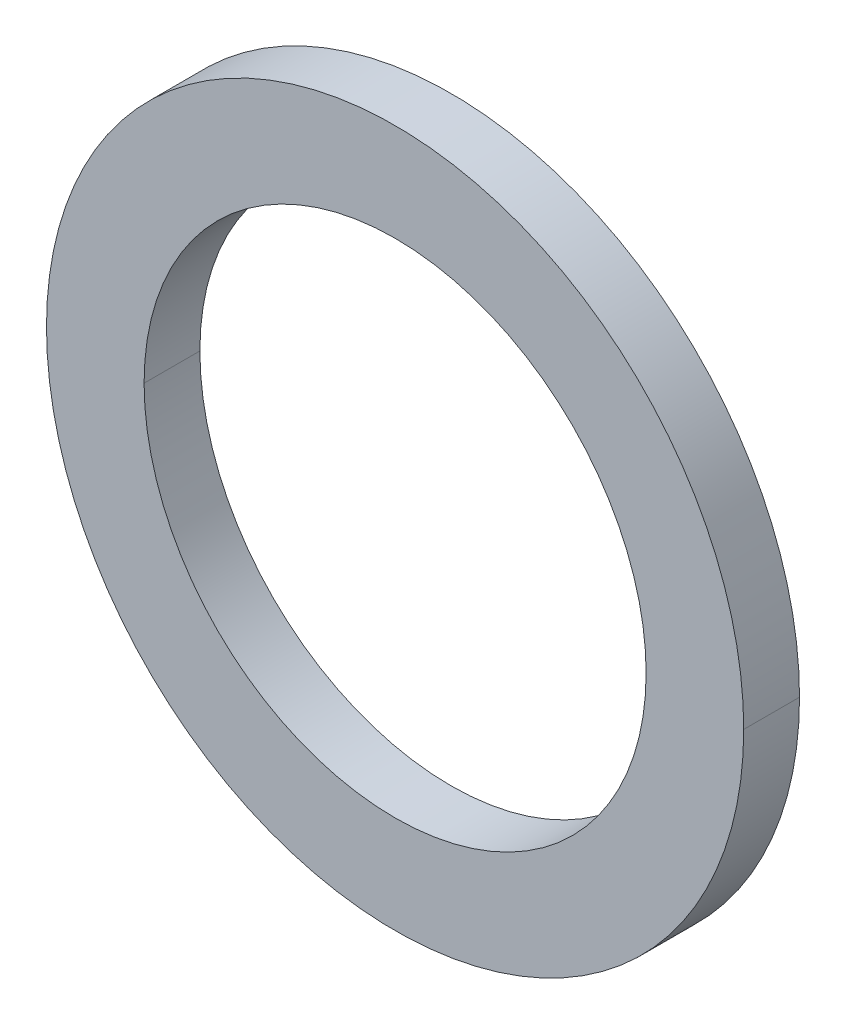
ISO-10303-21;
HEADER;
FILE_DESCRIPTION(('STEP AP214'),'2;1');
FILE_NAME('part.step','',(''),(''),'','','');
FILE_SCHEMA(('AUTOMOTIVE_DESIGN { 1 0 10303 214 1 1 1 1 }'));
ENDSEC;
DATA;
#1=APPLICATION_CONTEXT('core data for automotive mechanical design processes');
#2=APPLICATION_PROTOCOL_DEFINITION('international standard','automotive_design',2000,#1);
#3=PRODUCT_CONTEXT('',#1,'mechanical');
#4=PRODUCT('Part','Part','',(#3));
#5=PRODUCT_RELATED_PRODUCT_CATEGORY('part','',(#4));
#6=PRODUCT_DEFINITION_FORMATION('','',#4);
#7=PRODUCT_DEFINITION_CONTEXT('part definition',#1,'design');
#8=PRODUCT_DEFINITION('design','',#6,#7);
#9=PRODUCT_DEFINITION_SHAPE('','',#8);
#10=(LENGTH_UNIT() NAMED_UNIT(*) SI_UNIT(.MILLI.,.METRE.));
#11=(NAMED_UNIT(*) PLANE_ANGLE_UNIT() SI_UNIT($,.RADIAN.));
#12=(NAMED_UNIT(*) SI_UNIT($,.STERADIAN.) SOLID_ANGLE_UNIT());
#13=UNCERTAINTY_MEASURE_WITH_UNIT(LENGTH_MEASURE(1.E-05),#10,'distance_accuracy_value','');
#14=(GEOMETRIC_REPRESENTATION_CONTEXT(3) GLOBAL_UNCERTAINTY_ASSIGNED_CONTEXT((#13)) GLOBAL_UNIT_ASSIGNED_CONTEXT((#10,
#11,#12)) REPRESENTATION_CONTEXT('',''));
#15=CARTESIAN_POINT('',(0.,0.,0.));
#16=DIRECTION('',(0.,0.,1.));
#17=DIRECTION('',(1.,0.,0.));
#18=AXIS2_PLACEMENT_3D('',#15,#16,#17);
#19=CARTESIAN_POINT('',(0.,0.,1.27));
#20=DIRECTION('',(0.,0.,-1.));
#21=DIRECTION('',(-1.,0.,0.));
#22=AXIS2_PLACEMENT_3D('',#19,#20,#21);
#23=CYLINDRICAL_SURFACE('',#22,5.715);
#24=DIRECTION('',(0.,0.,-1.));
#25=VECTOR('',#24,1.);
#26=CARTESIAN_POINT('',(5.715,0.,1.27));
#27=LINE('',#26,#25);
#28=CARTESIAN_POINT('',(5.715,0.,1.27));
#29=VERTEX_POINT('',#28);
#30=CARTESIAN_POINT('',(5.715,0.,0.));
#31=VERTEX_POINT('',#30);
#32=EDGE_CURVE('E79',#29,#31,#27,.T.);
#33=ORIENTED_EDGE('',*,*,#32,.F.);
#34=CARTESIAN_POINT('',(0.,0.,1.27));
#35=DIRECTION('',(0.,0.,1.));
#36=DIRECTION('',(1.,0.,0.));
#37=AXIS2_PLACEMENT_3D('',#34,#35,#36);
#38=CIRCLE('',#37,5.715);
#39=CARTESIAN_POINT('',(-5.715,0.,1.27));
#40=VERTEX_POINT('',#39);
#41=EDGE_CURVE('E65',#29,#40,#38,.T.);
#42=ORIENTED_EDGE('',*,*,#41,.T.);
#43=DIRECTION('',(0.,0.,-1.));
#44=VECTOR('',#43,1.);
#45=CARTESIAN_POINT('',(-5.715,0.,1.27));
#46=LINE('',#45,#44);
#47=CARTESIAN_POINT('',(-5.715,0.,0.));
#48=VERTEX_POINT('',#47);
#49=EDGE_CURVE('E87',#40,#48,#46,.T.);
#50=ORIENTED_EDGE('',*,*,#49,.T.);
#51=CARTESIAN_POINT('',(0.,0.,0.));
#52=DIRECTION('',(0.,0.,1.));
#53=DIRECTION('',(1.,0.,0.));
#54=AXIS2_PLACEMENT_3D('',#51,#52,#53);
#55=CIRCLE('',#54,5.715);
#56=EDGE_CURVE('E10',#31,#48,#55,.T.);
#57=ORIENTED_EDGE('',*,*,#56,.F.);
#58=EDGE_LOOP('',(#33,#42,#50,#57));
#59=FACE_BOUND('',#58,.T.);
#60=ADVANCED_FACE('F16',(#59),#23,.F.);
#61=CARTESIAN_POINT('',(0.,0.,1.27));
#62=DIRECTION('',(0.,0.,-1.));
#63=DIRECTION('',(-1.,0.,0.));
#64=AXIS2_PLACEMENT_3D('',#61,#62,#63);
#65=CYLINDRICAL_SURFACE('',#64,7.9375);
#66=DIRECTION('',(0.,0.,-1.));
#67=VECTOR('',#66,1.);
#68=CARTESIAN_POINT('',(7.9375,0.,1.27));
#69=LINE('',#68,#67);
#70=CARTESIAN_POINT('',(7.9375,0.,1.27));
#71=VERTEX_POINT('',#70);
#72=CARTESIAN_POINT('',(7.9375,0.,0.));
#73=VERTEX_POINT('',#72);
#74=EDGE_CURVE('E99',#71,#73,#69,.T.);
#75=ORIENTED_EDGE('',*,*,#74,.F.);
#76=CARTESIAN_POINT('',(0.,0.,1.27));
#77=DIRECTION('',(0.,0.,1.));
#78=DIRECTION('',(1.,0.,0.));
#79=AXIS2_PLACEMENT_3D('',#76,#77,#78);
#80=CIRCLE('',#79,7.9375);
#81=CARTESIAN_POINT('',(-7.9375,0.,1.27));
#82=VERTEX_POINT('',#81);
#83=EDGE_CURVE('E76',#82,#71,#80,.T.);
#84=ORIENTED_EDGE('',*,*,#83,.F.);
#85=DIRECTION('',(0.,0.,-1.));
#86=VECTOR('',#85,1.);
#87=CARTESIAN_POINT('',(-7.9375,0.,1.27));
#88=LINE('',#87,#86);
#89=CARTESIAN_POINT('',(-7.9375,0.,0.));
#90=VERTEX_POINT('',#89);
#91=EDGE_CURVE('E221',#82,#90,#88,.T.);
#92=ORIENTED_EDGE('',*,*,#91,.T.);
#93=CARTESIAN_POINT('',(0.,0.,0.));
#94=DIRECTION('',(0.,0.,1.));
#95=DIRECTION('',(1.,0.,0.));
#96=AXIS2_PLACEMENT_3D('',#93,#94,#95);
#97=CIRCLE('',#96,7.9375);
#98=EDGE_CURVE('E27',#90,#73,#97,.T.);
#99=ORIENTED_EDGE('',*,*,#98,.T.);
#100=EDGE_LOOP('',(#75,#84,#92,#99));
#101=FACE_BOUND('',#100,.T.);
#102=ADVANCED_FACE('F18',(#101),#65,.T.);
#103=CARTESIAN_POINT('',(0.,0.,0.));
#104=DIRECTION('',(0.,0.,1.));
#105=DIRECTION('',(1.,0.,0.));
#106=AXIS2_PLACEMENT_3D('',#103,#104,#105);
#107=PLANE('',#106);
#108=CARTESIAN_POINT('',(0.,0.,0.));
#109=DIRECTION('',(0.,0.,1.));
#110=DIRECTION('',(1.,0.,0.));
#111=AXIS2_PLACEMENT_3D('',#108,#109,#110);
#112=CIRCLE('',#111,5.715);
#113=EDGE_CURVE('E84',#48,#31,#112,.T.);
#114=ORIENTED_EDGE('',*,*,#113,.T.);
#115=ORIENTED_EDGE('',*,*,#56,.T.);
#116=EDGE_LOOP('',(#114,#115));
#117=FACE_BOUND('',#116,.T.);
#118=ORIENTED_EDGE('',*,*,#98,.F.);
#119=CARTESIAN_POINT('',(0.,0.,0.));
#120=DIRECTION('',(0.,0.,1.));
#121=DIRECTION('',(1.,0.,0.));
#122=AXIS2_PLACEMENT_3D('',#119,#120,#121);
#123=CIRCLE('',#122,7.9375);
#124=EDGE_CURVE('E229',#73,#90,#123,.T.);
#125=ORIENTED_EDGE('',*,*,#124,.F.);
#126=EDGE_LOOP('',(#118,#125));
#127=FACE_BOUND('',#126,.T.);
#128=ADVANCED_FACE('F134',(#117,#127),#107,.F.);
#129=CARTESIAN_POINT('',(0.,0.,1.27));
#130=DIRECTION('',(0.,0.,1.));
#131=DIRECTION('',(1.,0.,0.));
#132=AXIS2_PLACEMENT_3D('',#129,#130,#131);
#133=PLANE('',#132);
#134=CARTESIAN_POINT('',(0.,0.,1.27));
#135=DIRECTION('',(0.,0.,1.));
#136=DIRECTION('',(1.,0.,0.));
#137=AXIS2_PLACEMENT_3D('',#134,#135,#136);
#138=CIRCLE('',#137,5.715);
#139=EDGE_CURVE('E20',#40,#29,#138,.T.);
#140=ORIENTED_EDGE('',*,*,#139,.F.);
#141=ORIENTED_EDGE('',*,*,#41,.F.);
#142=EDGE_LOOP('',(#140,#141));
#143=FACE_BOUND('',#142,.T.);
#144=ORIENTED_EDGE('',*,*,#83,.T.);
#145=CARTESIAN_POINT('',(0.,0.,1.27));
#146=DIRECTION('',(0.,0.,1.));
#147=DIRECTION('',(1.,0.,0.));
#148=AXIS2_PLACEMENT_3D('',#145,#146,#147);
#149=CIRCLE('',#148,7.9375);
#150=EDGE_CURVE('E228',#71,#82,#149,.T.);
#151=ORIENTED_EDGE('',*,*,#150,.T.);
#152=EDGE_LOOP('',(#144,#151));
#153=FACE_BOUND('',#152,.T.);
#154=ADVANCED_FACE('F72',(#143,#153),#133,.T.);
#155=CARTESIAN_POINT('',(0.,0.,1.27));
#156=DIRECTION('',(0.,0.,-1.));
#157=DIRECTION('',(-1.,0.,0.));
#158=AXIS2_PLACEMENT_3D('',#155,#156,#157);
#159=CYLINDRICAL_SURFACE('',#158,7.9375);
#160=ORIENTED_EDGE('',*,*,#150,.F.);
#161=ORIENTED_EDGE('',*,*,#74,.T.);
#162=ORIENTED_EDGE('',*,*,#124,.T.);
#163=ORIENTED_EDGE('',*,*,#91,.F.);
#164=EDGE_LOOP('',(#160,#161,#162,#163));
#165=FACE_BOUND('',#164,.T.);
#166=ADVANCED_FACE('F106',(#165),#159,.T.);
#167=CARTESIAN_POINT('',(0.,0.,1.27));
#168=DIRECTION('',(0.,0.,-1.));
#169=DIRECTION('',(-1.,0.,0.));
#170=AXIS2_PLACEMENT_3D('',#167,#168,#169);
#171=CYLINDRICAL_SURFACE('',#170,5.715);
#172=ORIENTED_EDGE('',*,*,#139,.T.);
#173=ORIENTED_EDGE('',*,*,#32,.T.);
#174=ORIENTED_EDGE('',*,*,#113,.F.);
#175=ORIENTED_EDGE('',*,*,#49,.F.);
#176=EDGE_LOOP('',(#172,#173,#174,#175));
#177=FACE_BOUND('',#176,.T.);
#178=ADVANCED_FACE('F86',(#177),#171,.F.);
#179=CLOSED_SHELL('',(#60,#102,#128,#154,#166,#178));
#180=MANIFOLD_SOLID_BREP('B1',#179);
#181=ADVANCED_BREP_SHAPE_REPRESENTATION('',(#18,#180),#14);
#182=SHAPE_DEFINITION_REPRESENTATION(#9,#181);
ENDSEC;
END-ISO-10303-21;
